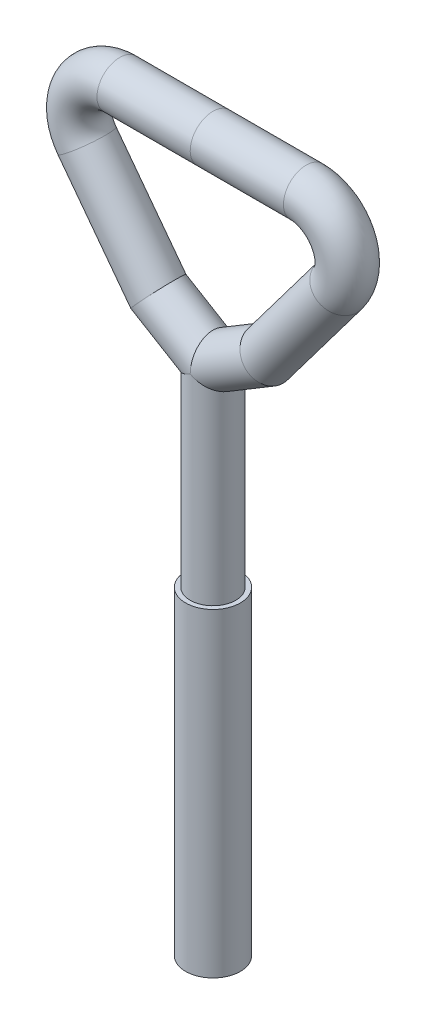
ISO-10303-21;
HEADER;
FILE_DESCRIPTION(('STEP AP214'),'2;1');
FILE_NAME('part.step','',(''),(''),'','','');
FILE_SCHEMA(('AUTOMOTIVE_DESIGN { 1 0 10303 214 1 1 1 1 }'));
ENDSEC;
DATA;
#1=APPLICATION_CONTEXT('core data for automotive mechanical design processes');
#2=APPLICATION_PROTOCOL_DEFINITION('international standard','automotive_design',2000,#1);
#3=PRODUCT_CONTEXT('',#1,'mechanical');
#4=PRODUCT('Part','Part','',(#3));
#5=PRODUCT_RELATED_PRODUCT_CATEGORY('part','',(#4));
#6=PRODUCT_DEFINITION_FORMATION('','',#4);
#7=PRODUCT_DEFINITION_CONTEXT('part definition',#1,'design');
#8=PRODUCT_DEFINITION('design','',#6,#7);
#9=PRODUCT_DEFINITION_SHAPE('','',#8);
#10=(LENGTH_UNIT() NAMED_UNIT(*) SI_UNIT(.MILLI.,.METRE.));
#11=(NAMED_UNIT(*) PLANE_ANGLE_UNIT() SI_UNIT($,.RADIAN.));
#12=(NAMED_UNIT(*) SI_UNIT($,.STERADIAN.) SOLID_ANGLE_UNIT());
#13=UNCERTAINTY_MEASURE_WITH_UNIT(LENGTH_MEASURE(1.E-05),#10,'distance_accuracy_value','');
#14=(GEOMETRIC_REPRESENTATION_CONTEXT(3) GLOBAL_UNCERTAINTY_ASSIGNED_CONTEXT((#13)) GLOBAL_UNIT_ASSIGNED_CONTEXT((#10,
#11,#12)) REPRESENTATION_CONTEXT('',''));
#15=CARTESIAN_POINT('',(0.,0.,0.));
#16=DIRECTION('',(0.,0.,1.));
#17=DIRECTION('',(1.,0.,0.));
#18=AXIS2_PLACEMENT_3D('',#15,#16,#17);
#19=CARTESIAN_POINT('',(2.91842614207552,-22.9535673383137,0.));
#20=DIRECTION('',(-0.857167300702114,0.515038074910052,0.));
#21=DIRECTION('',(-0.515038074910052,-0.857167300702114,0.));
#22=AXIS2_PLACEMENT_3D('',#19,#20,#21);
#23=CYLINDRICAL_SURFACE('',#22,2.5);
#24=CARTESIAN_POINT('',(-5.98417426415625,-17.6043453472703,0.));
#25=DIRECTION('',(-0.743144825477394,0.669130606358858,0.));
#26=DIRECTION('',(-0.669130606358858,-0.743144825477394,0.));
#27=AXIS2_PLACEMENT_3D('',#24,#25,#26);
#28=ELLIPSE('',#27,2.54679173738804,2.5);
#29=CARTESIAN_POINT('',(-7.68831056366444,-19.4969804484788,0.));
#30=VERTEX_POINT('',#29);
#31=EDGE_CURVE('E69',#30,#30,#28,.F.);
#32=ORIENTED_EDGE('',*,*,#31,.T.);
#33=EDGE_LOOP('',(#32));
#34=FACE_BOUND('',#33,.T.);
#35=CARTESIAN_POINT('',(0.,-21.2,0.));
#36=DIRECTION('',(-1.,0.,0.));
#37=DIRECTION('',(0.,-1.,0.));
#38=AXIS2_PLACEMENT_3D('',#35,#36,#37);
#39=ELLIPSE('',#38,2.91658349303833,2.5);
#40=CARTESIAN_POINT('',(0.,-21.2,-2.5));
#41=VERTEX_POINT('',#40);
#42=CARTESIAN_POINT('',(0.,-21.2,2.5));
#43=VERTEX_POINT('',#42);
#44=EDGE_CURVE('E49',#41,#43,#39,.F.);
#45=ORIENTED_EDGE('',*,*,#44,.F.);
#46=CARTESIAN_POINT('',(0.,-21.2,0.));
#47=DIRECTION('',(-0.49242356010347,0.870355695939898,0.));
#48=DIRECTION('',(-0.870355695939898,-0.49242356010347,0.));
#49=AXIS2_PLACEMENT_3D('',#46,#47,#48);
#50=ELLIPSE('',#49,2.87238885396188,2.5);
#51=EDGE_CURVE('E55',#41,#43,#50,.T.);
#52=ORIENTED_EDGE('',*,*,#51,.T.);
#53=EDGE_LOOP('',(#45,#52));
#54=FACE_BOUND('',#53,.T.);
#55=ADVANCED_FACE('F41',(#34,#54),#23,.T.);
#56=CARTESIAN_POINT('',(6.98628144113905,-17.0022186085764,0.));
#57=DIRECTION('',(-0.85716730070211,-0.515038074910058,0.));
#58=DIRECTION('',(0.515038074910058,-0.85716730070211,0.));
#59=AXIS2_PLACEMENT_3D('',#56,#57,#58);
#60=CYLINDRICAL_SURFACE('',#59,2.5);
#61=CARTESIAN_POINT('',(5.98417426415614,-17.6043453472703,0.));
#62=DIRECTION('',(-0.743144825477393,-0.669130606358859,0.));
#63=DIRECTION('',(-0.669130606358859,0.743144825477393,0.));
#64=AXIS2_PLACEMENT_3D('',#61,#62,#63);
#65=ELLIPSE('',#64,2.54679173738803,2.5);
#66=CARTESIAN_POINT('',(4.28003796464796,-15.7117102460618,0.));
#67=VERTEX_POINT('',#66);
#68=EDGE_CURVE('E66',#67,#67,#65,.F.);
#69=ORIENTED_EDGE('',*,*,#68,.F.);
#70=EDGE_LOOP('',(#69));
#71=FACE_BOUND('',#70,.T.);
#72=ORIENTED_EDGE('',*,*,#44,.T.);
#73=CARTESIAN_POINT('',(0.,-21.2,0.));
#74=DIRECTION('',(-0.492423560103463,-0.870355695939902,0.));
#75=DIRECTION('',(-0.870355695939902,0.492423560103463,0.));
#76=AXIS2_PLACEMENT_3D('',#73,#74,#75);
#77=ELLIPSE('',#76,2.87238885396188,2.5);
#78=EDGE_CURVE('E11',#43,#41,#77,.F.);
#79=ORIENTED_EDGE('',*,*,#78,.T.);
#80=EDGE_LOOP('',(#72,#79));
#81=FACE_BOUND('',#80,.T.);
#82=ADVANCED_FACE('F65',(#71,#81),#60,.T.);
#83=CARTESIAN_POINT('',(0.,0.,0.));
#84=DIRECTION('',(1.,0.,0.));
#85=DIRECTION('',(0.,1.,0.));
#86=AXIS2_PLACEMENT_3D('',#83,#84,#85);
#87=CYLINDRICAL_SURFACE('',#86,2.5);
#88=CARTESIAN_POINT('',(10.2243963128344,0.,0.));
#89=DIRECTION('',(1.,0.,0.));
#90=DIRECTION('',(0.,0.,-1.));
#91=AXIS2_PLACEMENT_3D('',#88,#89,#90);
#92=CIRCLE('',#91,2.5);
#93=CARTESIAN_POINT('',(10.2243963128344,2.5,0.));
#94=VERTEX_POINT('',#93);
#95=EDGE_CURVE('E78',#94,#94,#92,.T.);
#96=ORIENTED_EDGE('',*,*,#95,.F.);
#97=EDGE_LOOP('',(#96));
#98=FACE_BOUND('',#97,.T.);
#99=CARTESIAN_POINT('',(0.,0.,0.));
#100=DIRECTION('',(1.,0.,0.));
#101=DIRECTION('',(0.,0.,-1.));
#102=AXIS2_PLACEMENT_3D('',#99,#100,#101);
#103=CIRCLE('',#102,2.5);
#104=CARTESIAN_POINT('',(0.,0.,-2.5));
#105=VERTEX_POINT('',#104);
#106=EDGE_CURVE('E62',#105,#105,#103,.T.);
#107=ORIENTED_EDGE('',*,*,#106,.T.);
#108=EDGE_LOOP('',(#107));
#109=FACE_BOUND('',#108,.T.);
#110=ADVANCED_FACE('F99',(#98,#109),#87,.T.);
#111=CARTESIAN_POINT('',(10.2243963128344,-4.5,0.));
#112=DIRECTION('',(0.,0.,-1.));
#113=DIRECTION('',(-1.,0.,0.));
#114=AXIS2_PLACEMENT_3D('',#111,#112,#113);
#115=TOROIDAL_SURFACE('',#114,4.5,2.5);
#116=CARTESIAN_POINT('',(13.8182561080472,-7.20816760418422,0.));
#117=DIRECTION('',(-0.60181502315205,-0.798635510047292,0.));
#118=DIRECTION('',(0.,0.,-1.));
#119=AXIS2_PLACEMENT_3D('',#116,#117,#118);
#120=CIRCLE('',#119,2.5);
#121=CARTESIAN_POINT('',(15.8148448831654,-8.71270516206434,0.));
#122=VERTEX_POINT('',#121);
#123=EDGE_CURVE('E81',#122,#122,#120,.T.);
#124=CARTESIAN_POINT('',(10.2243963128344,-4.5,0.));
#125=DIRECTION('',(0.,0.,-1.));
#126=DIRECTION('',(-1.,0.,0.));
#127=AXIS2_PLACEMENT_3D('',#124,#125,#126);
#128=CIRCLE('',#127,7.);
#129=EDGE_CURVE('',#94,#122,#128,.T.);
#130=ORIENTED_EDGE('',*,*,#95,.T.);
#131=ORIENTED_EDGE('',*,*,#123,.F.);
#132=ORIENTED_EDGE('',*,*,#129,.T.);
#133=ORIENTED_EDGE('',*,*,#129,.F.);
#134=EDGE_LOOP('',(#130,#132,#131,#133));
#135=FACE_BOUND('',#134,.T.);
#136=ADVANCED_FACE('F114',(#135),#115,.T.);
#137=CARTESIAN_POINT('',(13.8182561080472,-7.20816760418422,0.));
#138=DIRECTION('',(-0.601815023152049,-0.798635510047292,0.));
#139=DIRECTION('',(0.798635510047292,-0.601815023152049,0.));
#140=AXIS2_PLACEMENT_3D('',#137,#138,#139);
#141=CYLINDRICAL_SURFACE('',#140,2.5);
#142=ORIENTED_EDGE('',*,*,#123,.T.);
#143=EDGE_LOOP('',(#142));
#144=FACE_BOUND('',#143,.T.);
#145=ORIENTED_EDGE('',*,*,#68,.T.);
#146=EDGE_LOOP('',(#145));
#147=FACE_BOUND('',#146,.T.);
#148=ADVANCED_FACE('F118',(#144,#147),#141,.T.);
#149=CARTESIAN_POINT('',(-10.2243963128344,0.,0.));
#150=DIRECTION('',(1.,0.,0.));
#151=DIRECTION('',(0.,1.,0.));
#152=AXIS2_PLACEMENT_3D('',#149,#150,#151);
#153=CYLINDRICAL_SURFACE('',#152,2.5);
#154=CARTESIAN_POINT('',(-10.2243963128344,0.,0.));
#155=DIRECTION('',(1.,0.,0.));
#156=DIRECTION('',(0.,0.,-1.));
#157=AXIS2_PLACEMENT_3D('',#154,#155,#156);
#158=CIRCLE('',#157,2.5);
#159=CARTESIAN_POINT('',(-10.2243963128344,2.5,0.));
#160=VERTEX_POINT('',#159);
#161=EDGE_CURVE('E84',#160,#160,#158,.T.);
#162=ORIENTED_EDGE('',*,*,#161,.T.);
#163=EDGE_LOOP('',(#162));
#164=FACE_BOUND('',#163,.T.);
#165=ORIENTED_EDGE('',*,*,#106,.F.);
#166=EDGE_LOOP('',(#165));
#167=FACE_BOUND('',#166,.T.);
#168=ADVANCED_FACE('F100',(#164,#167),#153,.T.);
#169=CARTESIAN_POINT('',(-10.2243963128344,-4.5,0.));
#170=DIRECTION('',(0.,0.,-1.));
#171=DIRECTION('',(-1.,0.,0.));
#172=AXIS2_PLACEMENT_3D('',#169,#170,#171);
#173=TOROIDAL_SURFACE('',#172,4.5,2.5);
#174=CARTESIAN_POINT('',(-13.8182561080473,-7.2081676041842,0.));
#175=DIRECTION('',(-0.601815023152046,0.798635510047294,0.));
#176=DIRECTION('',(0.,0.,-1.));
#177=AXIS2_PLACEMENT_3D('',#174,#175,#176);
#178=CIRCLE('',#177,2.5);
#179=CARTESIAN_POINT('',(-15.8148448831655,-8.71270516206432,0.));
#180=VERTEX_POINT('',#179);
#181=EDGE_CURVE('E75',#180,#180,#178,.T.);
#182=CARTESIAN_POINT('',(-10.2243963128344,-4.5,0.));
#183=DIRECTION('',(0.,0.,-1.));
#184=DIRECTION('',(-1.,0.,0.));
#185=AXIS2_PLACEMENT_3D('',#182,#183,#184);
#186=CIRCLE('',#185,7.);
#187=EDGE_CURVE('',#180,#160,#186,.T.);
#188=ORIENTED_EDGE('',*,*,#181,.T.);
#189=ORIENTED_EDGE('',*,*,#161,.F.);
#190=ORIENTED_EDGE('',*,*,#187,.T.);
#191=ORIENTED_EDGE('',*,*,#187,.F.);
#192=EDGE_LOOP('',(#188,#190,#189,#191));
#193=FACE_BOUND('',#192,.T.);
#194=ADVANCED_FACE('F89',(#193),#173,.T.);
#195=CARTESIAN_POINT('',(-5.28059731549894,-18.5380234935975,0.));
#196=DIRECTION('',(-0.601815023152046,0.798635510047294,0.));
#197=DIRECTION('',(-0.798635510047294,-0.601815023152046,0.));
#198=AXIS2_PLACEMENT_3D('',#195,#196,#197);
#199=CYLINDRICAL_SURFACE('',#198,2.5);
#200=ORIENTED_EDGE('',*,*,#31,.F.);
#201=EDGE_LOOP('',(#200));
#202=FACE_BOUND('',#201,.T.);
#203=ORIENTED_EDGE('',*,*,#181,.F.);
#204=EDGE_LOOP('',(#203));
#205=FACE_BOUND('',#204,.T.);
#206=ADVANCED_FACE('F43',(#202,#205),#199,.T.);
#207=CARTESIAN_POINT('',(0.,-21.2,0.));
#208=DIRECTION('',(0.,-1.,0.));
#209=DIRECTION('',(1.,0.,0.));
#210=AXIS2_PLACEMENT_3D('',#207,#208,#209);
#211=CYLINDRICAL_SURFACE('',#210,2.5);
#212=ORIENTED_EDGE('',*,*,#51,.F.);
#213=ORIENTED_EDGE('',*,*,#78,.F.);
#214=EDGE_LOOP('',(#212,#213));
#215=FACE_BOUND('',#214,.T.);
#216=CARTESIAN_POINT('',(0.,-42.7,0.));
#217=DIRECTION('',(0.,1.,0.));
#218=DIRECTION('',(0.,0.,1.));
#219=AXIS2_PLACEMENT_3D('',#216,#217,#218);
#220=CIRCLE('',#219,2.5);
#221=CARTESIAN_POINT('',(0.,-42.7,2.5));
#222=VERTEX_POINT('',#221);
#223=EDGE_CURVE('E63',#222,#222,#220,.T.);
#224=ORIENTED_EDGE('',*,*,#223,.T.);
#225=EDGE_LOOP('',(#224));
#226=FACE_BOUND('',#225,.T.);
#227=ADVANCED_FACE('F56',(#215,#226),#211,.T.);
#228=CARTESIAN_POINT('',(0.,-77.7,0.));
#229=DIRECTION('',(0.,1.,0.));
#230=DIRECTION('',(0.,0.,1.));
#231=AXIS2_PLACEMENT_3D('',#228,#229,#230);
#232=CYLINDRICAL_SURFACE('',#231,3.00000000000008);
#233=CARTESIAN_POINT('',(0.,-77.7,0.));
#234=DIRECTION('',(0.,-1.,0.));
#235=DIRECTION('',(0.,0.,-1.));
#236=AXIS2_PLACEMENT_3D('',#233,#234,#235);
#237=CIRCLE('',#236,3.00000000000008);
#238=CARTESIAN_POINT('',(0.,-77.7,-3.00000000000008));
#239=VERTEX_POINT('',#238);
#240=EDGE_CURVE('E203',#239,#239,#237,.T.);
#241=ORIENTED_EDGE('',*,*,#240,.F.);
#242=EDGE_LOOP('',(#241));
#243=FACE_BOUND('',#242,.T.);
#244=CARTESIAN_POINT('',(0.,-42.7,0.));
#245=DIRECTION('',(0.,-1.,0.));
#246=DIRECTION('',(0.,0.,-1.));
#247=AXIS2_PLACEMENT_3D('',#244,#245,#246);
#248=CIRCLE('',#247,3.00000000000008);
#249=CARTESIAN_POINT('',(0.,-42.7,-3.00000000000008));
#250=VERTEX_POINT('',#249);
#251=EDGE_CURVE('E201',#250,#250,#248,.T.);
#252=ORIENTED_EDGE('',*,*,#251,.T.);
#253=EDGE_LOOP('',(#252));
#254=FACE_BOUND('',#253,.T.);
#255=ADVANCED_FACE('F97',(#243,#254),#232,.T.);
#256=CARTESIAN_POINT('',(0.,-77.7,0.));
#257=DIRECTION('',(0.,-1.,0.));
#258=DIRECTION('',(0.,0.,-1.));
#259=AXIS2_PLACEMENT_3D('',#256,#257,#258);
#260=PLANE('',#259);
#261=ORIENTED_EDGE('',*,*,#240,.T.);
#262=EDGE_LOOP('',(#261));
#263=FACE_BOUND('',#262,.T.);
#264=ADVANCED_FACE('F167',(#263),#260,.T.);
#265=CARTESIAN_POINT('',(0.,-42.7,0.));
#266=DIRECTION('',(0.,-1.,0.));
#267=DIRECTION('',(0.,0.,-1.));
#268=AXIS2_PLACEMENT_3D('',#265,#266,#267);
#269=PLANE('',#268);
#270=ORIENTED_EDGE('',*,*,#223,.F.);
#271=EDGE_LOOP('',(#270));
#272=FACE_BOUND('',#271,.T.);
#273=ORIENTED_EDGE('',*,*,#251,.F.);
#274=EDGE_LOOP('',(#273));
#275=FACE_BOUND('',#274,.T.);
#276=ADVANCED_FACE('F179',(#272,#275),#269,.F.);
#277=CLOSED_SHELL('',(#55,#82,#110,#136,#148,#168,#194,#206,#227,#255,#264,#276));
#278=MANIFOLD_SOLID_BREP('B2',#277);
#279=ADVANCED_BREP_SHAPE_REPRESENTATION('',(#18,#278),#14);
#280=SHAPE_DEFINITION_REPRESENTATION(#9,#279);
ENDSEC;
END-ISO-10303-21;
